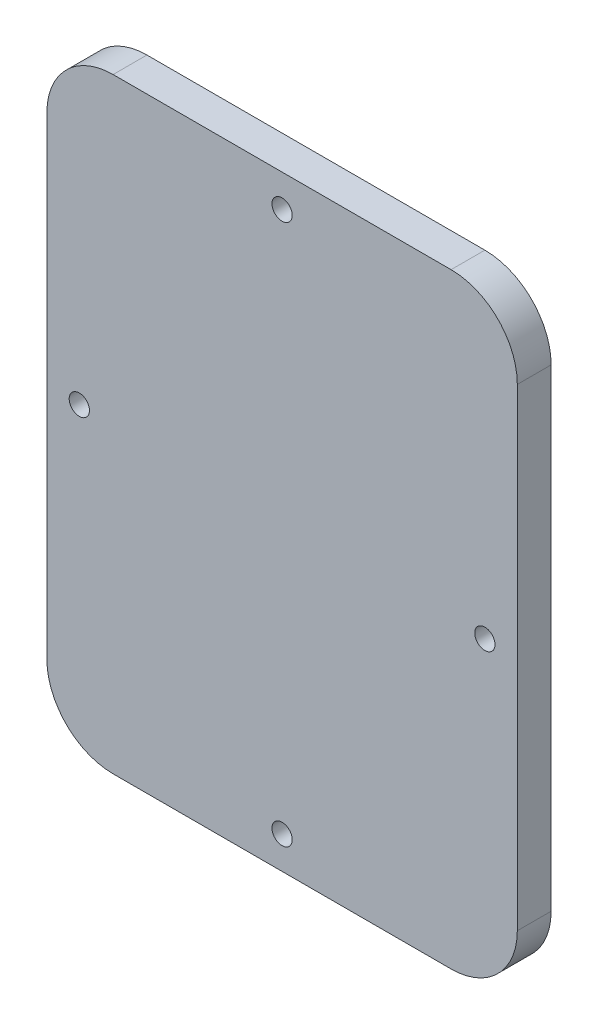
ISO-10303-21;
HEADER;
FILE_DESCRIPTION(('STEP AP214'),'2;1');
FILE_NAME('part.step','',(''),(''),'','','');
FILE_SCHEMA(('AUTOMOTIVE_DESIGN { 1 0 10303 214 1 1 1 1 }'));
ENDSEC;
DATA;
#1=APPLICATION_CONTEXT('core data for automotive mechanical design processes');
#2=APPLICATION_PROTOCOL_DEFINITION('international standard','automotive_design',2000,#1);
#3=PRODUCT_CONTEXT('',#1,'mechanical');
#4=PRODUCT('Part','Part','',(#3));
#5=PRODUCT_RELATED_PRODUCT_CATEGORY('part','',(#4));
#6=PRODUCT_DEFINITION_FORMATION('','',#4);
#7=PRODUCT_DEFINITION_CONTEXT('part definition',#1,'design');
#8=PRODUCT_DEFINITION('design','',#6,#7);
#9=PRODUCT_DEFINITION_SHAPE('','',#8);
#10=(LENGTH_UNIT() NAMED_UNIT(*) SI_UNIT(.MILLI.,.METRE.));
#11=(NAMED_UNIT(*) PLANE_ANGLE_UNIT() SI_UNIT($,.RADIAN.));
#12=(NAMED_UNIT(*) SI_UNIT($,.STERADIAN.) SOLID_ANGLE_UNIT());
#13=UNCERTAINTY_MEASURE_WITH_UNIT(LENGTH_MEASURE(1.E-05),#10,'distance_accuracy_value','');
#14=(GEOMETRIC_REPRESENTATION_CONTEXT(3) GLOBAL_UNCERTAINTY_ASSIGNED_CONTEXT((#13)) GLOBAL_UNIT_ASSIGNED_CONTEXT((#10,
#11,#12)) REPRESENTATION_CONTEXT('',''));
#15=CARTESIAN_POINT('',(0.,0.,0.));
#16=DIRECTION('',(0.,0.,1.));
#17=DIRECTION('',(1.,0.,0.));
#18=AXIS2_PLACEMENT_3D('',#15,#16,#17);
#19=CARTESIAN_POINT('',(34.8,0.,5.));
#20=DIRECTION('',(-1.,0.,0.));
#21=DIRECTION('',(0.,0.,1.));
#22=AXIS2_PLACEMENT_3D('',#19,#20,#21);
#23=PLANE('',#22);
#24=DIRECTION('',(0.,1.,0.));
#25=VECTOR('',#24,1.);
#26=CARTESIAN_POINT('',(34.8,0.,0.));
#27=LINE('',#26,#25);
#28=CARTESIAN_POINT('',(34.8,-34.9999999999999,0.));
#29=VERTEX_POINT('',#28);
#30=CARTESIAN_POINT('',(34.8,34.9999999999999,0.));
#31=VERTEX_POINT('',#30);
#32=EDGE_CURVE('E162',#29,#31,#27,.T.);
#33=ORIENTED_EDGE('',*,*,#32,.T.);
#34=DIRECTION('',(0.,0.,-1.));
#35=VECTOR('',#34,1.);
#36=CARTESIAN_POINT('',(34.8,34.9999999999999,5.));
#37=LINE('',#36,#35);
#38=CARTESIAN_POINT('',(34.8,34.9999999999999,5.));
#39=VERTEX_POINT('',#38);
#40=EDGE_CURVE('E11',#39,#31,#37,.T.);
#41=ORIENTED_EDGE('',*,*,#40,.F.);
#42=DIRECTION('',(0.,1.,0.));
#43=VECTOR('',#42,1.);
#44=CARTESIAN_POINT('',(34.8,0.,5.));
#45=LINE('',#44,#43);
#46=CARTESIAN_POINT('',(34.8,-34.9999999999999,5.));
#47=VERTEX_POINT('',#46);
#48=EDGE_CURVE('E231',#47,#39,#45,.T.);
#49=ORIENTED_EDGE('',*,*,#48,.F.);
#50=DIRECTION('',(0.,0.,-1.));
#51=VECTOR('',#50,1.);
#52=CARTESIAN_POINT('',(34.8,-34.9999999999999,5.));
#53=LINE('',#52,#51);
#54=EDGE_CURVE('E149',#47,#29,#53,.T.);
#55=ORIENTED_EDGE('',*,*,#54,.T.);
#56=EDGE_LOOP('',(#33,#41,#49,#55));
#57=FACE_BOUND('',#56,.T.);
#58=ADVANCED_FACE('F45',(#57),#23,.F.);
#59=CARTESIAN_POINT('',(25.,35.,5.));
#60=DIRECTION('',(0.,0.,-1.));
#61=DIRECTION('',(-1.,0.,0.));
#62=AXIS2_PLACEMENT_3D('',#59,#60,#61);
#63=CYLINDRICAL_SURFACE('',#62,9.8);
#64=CARTESIAN_POINT('',(25.,35.,0.));
#65=DIRECTION('',(0.,0.,1.));
#66=DIRECTION('',(1.,0.,0.));
#67=AXIS2_PLACEMENT_3D('',#64,#65,#66);
#68=CIRCLE('',#67,9.8);
#69=CARTESIAN_POINT('',(24.9999999999999,44.8,0.));
#70=VERTEX_POINT('',#69);
#71=EDGE_CURVE('E166',#31,#70,#68,.T.);
#72=ORIENTED_EDGE('',*,*,#71,.T.);
#73=DIRECTION('',(0.,0.,-1.));
#74=VECTOR('',#73,1.);
#75=CARTESIAN_POINT('',(24.9999999999999,44.8,5.));
#76=LINE('',#75,#74);
#77=CARTESIAN_POINT('',(24.9999999999999,44.8,5.));
#78=VERTEX_POINT('',#77);
#79=EDGE_CURVE('E55',#78,#70,#76,.T.);
#80=ORIENTED_EDGE('',*,*,#79,.F.);
#81=CARTESIAN_POINT('',(25.,35.,5.));
#82=DIRECTION('',(0.,0.,1.));
#83=DIRECTION('',(1.,0.,0.));
#84=AXIS2_PLACEMENT_3D('',#81,#82,#83);
#85=CIRCLE('',#84,9.8);
#86=EDGE_CURVE('E102',#39,#78,#85,.T.);
#87=ORIENTED_EDGE('',*,*,#86,.F.);
#88=ORIENTED_EDGE('',*,*,#40,.T.);
#89=EDGE_LOOP('',(#72,#80,#87,#88));
#90=FACE_BOUND('',#89,.T.);
#91=ADVANCED_FACE('F274',(#90),#63,.T.);
#92=CARTESIAN_POINT('',(0.,44.8,5.));
#93=DIRECTION('',(0.,-1.,0.));
#94=DIRECTION('',(0.,0.,-1.));
#95=AXIS2_PLACEMENT_3D('',#92,#93,#94);
#96=PLANE('',#95);
#97=DIRECTION('',(-1.,0.,0.));
#98=VECTOR('',#97,1.);
#99=CARTESIAN_POINT('',(0.,44.8,0.));
#100=LINE('',#99,#98);
#101=CARTESIAN_POINT('',(-24.9999999999999,44.8,0.));
#102=VERTEX_POINT('',#101);
#103=EDGE_CURVE('E169',#70,#102,#100,.T.);
#104=ORIENTED_EDGE('',*,*,#103,.T.);
#105=DIRECTION('',(0.,0.,-1.));
#106=VECTOR('',#105,1.);
#107=CARTESIAN_POINT('',(-24.9999999999999,44.8,5.));
#108=LINE('',#107,#106);
#109=CARTESIAN_POINT('',(-24.9999999999999,44.8,5.));
#110=VERTEX_POINT('',#109);
#111=EDGE_CURVE('E201',#110,#102,#108,.T.);
#112=ORIENTED_EDGE('',*,*,#111,.F.);
#113=DIRECTION('',(-1.,0.,0.));
#114=VECTOR('',#113,1.);
#115=CARTESIAN_POINT('',(0.,44.8,5.));
#116=LINE('',#115,#114);
#117=EDGE_CURVE('E211',#78,#110,#116,.T.);
#118=ORIENTED_EDGE('',*,*,#117,.F.);
#119=ORIENTED_EDGE('',*,*,#79,.T.);
#120=EDGE_LOOP('',(#104,#112,#118,#119));
#121=FACE_BOUND('',#120,.T.);
#122=ADVANCED_FACE('F209',(#121),#96,.F.);
#123=CARTESIAN_POINT('',(-25.,35.,5.));
#124=DIRECTION('',(0.,0.,-1.));
#125=DIRECTION('',(-1.,0.,0.));
#126=AXIS2_PLACEMENT_3D('',#123,#124,#125);
#127=CYLINDRICAL_SURFACE('',#126,9.80000000000001);
#128=CARTESIAN_POINT('',(-25.,35.,0.));
#129=DIRECTION('',(0.,0.,1.));
#130=DIRECTION('',(1.,0.,0.));
#131=AXIS2_PLACEMENT_3D('',#128,#129,#130);
#132=CIRCLE('',#131,9.80000000000001);
#133=CARTESIAN_POINT('',(-34.8,34.9999999999999,0.));
#134=VERTEX_POINT('',#133);
#135=EDGE_CURVE('E172',#102,#134,#132,.T.);
#136=ORIENTED_EDGE('',*,*,#135,.T.);
#137=DIRECTION('',(0.,0.,-1.));
#138=VECTOR('',#137,1.);
#139=CARTESIAN_POINT('',(-34.8,34.9999999999999,5.));
#140=LINE('',#139,#138);
#141=CARTESIAN_POINT('',(-34.8,34.9999999999999,5.));
#142=VERTEX_POINT('',#141);
#143=EDGE_CURVE('E198',#142,#134,#140,.T.);
#144=ORIENTED_EDGE('',*,*,#143,.F.);
#145=CARTESIAN_POINT('',(-25.,35.,5.));
#146=DIRECTION('',(0.,0.,1.));
#147=DIRECTION('',(1.,0.,0.));
#148=AXIS2_PLACEMENT_3D('',#145,#146,#147);
#149=CIRCLE('',#148,9.80000000000001);
#150=EDGE_CURVE('E222',#110,#142,#149,.T.);
#151=ORIENTED_EDGE('',*,*,#150,.F.);
#152=ORIENTED_EDGE('',*,*,#111,.T.);
#153=EDGE_LOOP('',(#136,#144,#151,#152));
#154=FACE_BOUND('',#153,.T.);
#155=ADVANCED_FACE('F220',(#154),#127,.T.);
#156=CARTESIAN_POINT('',(-34.8,0.,5.));
#157=DIRECTION('',(-1.,0.,0.));
#158=DIRECTION('',(0.,0.,1.));
#159=AXIS2_PLACEMENT_3D('',#156,#157,#158);
#160=PLANE('',#159);
#161=DIRECTION('',(0.,1.,0.));
#162=VECTOR('',#161,1.);
#163=CARTESIAN_POINT('',(-34.8,0.,0.));
#164=LINE('',#163,#162);
#165=CARTESIAN_POINT('',(-34.8,-34.9999999999999,0.));
#166=VERTEX_POINT('',#165);
#167=EDGE_CURVE('E176',#166,#134,#164,.T.);
#168=ORIENTED_EDGE('',*,*,#167,.F.);
#169=DIRECTION('',(0.,0.,-1.));
#170=VECTOR('',#169,1.);
#171=CARTESIAN_POINT('',(-34.8,-34.9999999999999,5.));
#172=LINE('',#171,#170);
#173=CARTESIAN_POINT('',(-34.8,-34.9999999999999,5.));
#174=VERTEX_POINT('',#173);
#175=EDGE_CURVE('E128',#174,#166,#172,.T.);
#176=ORIENTED_EDGE('',*,*,#175,.F.);
#177=DIRECTION('',(0.,1.,0.));
#178=VECTOR('',#177,1.);
#179=CARTESIAN_POINT('',(-34.8,0.,5.));
#180=LINE('',#179,#178);
#181=EDGE_CURVE('E135',#174,#142,#180,.T.);
#182=ORIENTED_EDGE('',*,*,#181,.T.);
#183=ORIENTED_EDGE('',*,*,#143,.T.);
#184=EDGE_LOOP('',(#168,#176,#182,#183));
#185=FACE_BOUND('',#184,.T.);
#186=ADVANCED_FACE('F285',(#185),#160,.T.);
#187=CARTESIAN_POINT('',(-25.,-35.,5.));
#188=DIRECTION('',(0.,0.,-1.));
#189=DIRECTION('',(-1.,0.,0.));
#190=AXIS2_PLACEMENT_3D('',#187,#188,#189);
#191=CYLINDRICAL_SURFACE('',#190,9.8);
#192=CARTESIAN_POINT('',(-25.,-35.,0.));
#193=DIRECTION('',(0.,0.,1.));
#194=DIRECTION('',(1.,0.,0.));
#195=AXIS2_PLACEMENT_3D('',#192,#193,#194);
#196=CIRCLE('',#195,9.8);
#197=CARTESIAN_POINT('',(-24.9999999999999,-44.8,0.));
#198=VERTEX_POINT('',#197);
#199=EDGE_CURVE('E122',#198,#166,#196,.F.);
#200=ORIENTED_EDGE('',*,*,#199,.F.);
#201=DIRECTION('',(0.,0.,-1.));
#202=VECTOR('',#201,1.);
#203=CARTESIAN_POINT('',(-24.9999999999999,-44.8,5.));
#204=LINE('',#203,#202);
#205=CARTESIAN_POINT('',(-24.9999999999999,-44.8,5.));
#206=VERTEX_POINT('',#205);
#207=EDGE_CURVE('E117',#206,#198,#204,.T.);
#208=ORIENTED_EDGE('',*,*,#207,.F.);
#209=CARTESIAN_POINT('',(-25.,-35.,5.));
#210=DIRECTION('',(0.,0.,1.));
#211=DIRECTION('',(1.,0.,0.));
#212=AXIS2_PLACEMENT_3D('',#209,#210,#211);
#213=CIRCLE('',#212,9.8);
#214=EDGE_CURVE('E120',#206,#174,#213,.F.);
#215=ORIENTED_EDGE('',*,*,#214,.T.);
#216=ORIENTED_EDGE('',*,*,#175,.T.);
#217=EDGE_LOOP('',(#200,#208,#215,#216));
#218=FACE_BOUND('',#217,.T.);
#219=ADVANCED_FACE('F119',(#218),#191,.T.);
#220=CARTESIAN_POINT('',(0.,-44.8,5.));
#221=DIRECTION('',(0.,-1.,0.));
#222=DIRECTION('',(1.,0.,0.));
#223=AXIS2_PLACEMENT_3D('',#220,#221,#222);
#224=PLANE('',#223);
#225=DIRECTION('',(-1.,0.,0.));
#226=VECTOR('',#225,1.);
#227=CARTESIAN_POINT('',(0.,-44.8,0.));
#228=LINE('',#227,#226);
#229=CARTESIAN_POINT('',(24.9999999999999,-44.8,0.));
#230=VERTEX_POINT('',#229);
#231=EDGE_CURVE('E182',#230,#198,#228,.T.);
#232=ORIENTED_EDGE('',*,*,#231,.F.);
#233=DIRECTION('',(0.,0.,-1.));
#234=VECTOR('',#233,1.);
#235=CARTESIAN_POINT('',(24.9999999999999,-44.8,5.));
#236=LINE('',#235,#234);
#237=CARTESIAN_POINT('',(24.9999999999999,-44.8,5.));
#238=VERTEX_POINT('',#237);
#239=EDGE_CURVE('E91',#238,#230,#236,.T.);
#240=ORIENTED_EDGE('',*,*,#239,.F.);
#241=DIRECTION('',(-1.,0.,0.));
#242=VECTOR('',#241,1.);
#243=CARTESIAN_POINT('',(0.,-44.8,5.));
#244=LINE('',#243,#242);
#245=EDGE_CURVE('E133',#238,#206,#244,.T.);
#246=ORIENTED_EDGE('',*,*,#245,.T.);
#247=ORIENTED_EDGE('',*,*,#207,.T.);
#248=EDGE_LOOP('',(#232,#240,#246,#247));
#249=FACE_BOUND('',#248,.T.);
#250=ADVANCED_FACE('F138',(#249),#224,.T.);
#251=CARTESIAN_POINT('',(25.,-35.,5.));
#252=DIRECTION('',(0.,0.,-1.));
#253=DIRECTION('',(-1.,0.,0.));
#254=AXIS2_PLACEMENT_3D('',#251,#252,#253);
#255=CYLINDRICAL_SURFACE('',#254,9.8);
#256=CARTESIAN_POINT('',(25.,-35.,0.));
#257=DIRECTION('',(0.,0.,1.));
#258=DIRECTION('',(1.,0.,0.));
#259=AXIS2_PLACEMENT_3D('',#256,#257,#258);
#260=CIRCLE('',#259,9.8);
#261=EDGE_CURVE('E94',#230,#29,#260,.T.);
#262=ORIENTED_EDGE('',*,*,#261,.T.);
#263=ORIENTED_EDGE('',*,*,#54,.F.);
#264=CARTESIAN_POINT('',(25.,-35.,5.));
#265=DIRECTION('',(0.,0.,1.));
#266=DIRECTION('',(1.,0.,0.));
#267=AXIS2_PLACEMENT_3D('',#264,#265,#266);
#268=CIRCLE('',#267,9.8);
#269=EDGE_CURVE('E63',#238,#47,#268,.T.);
#270=ORIENTED_EDGE('',*,*,#269,.F.);
#271=ORIENTED_EDGE('',*,*,#239,.T.);
#272=EDGE_LOOP('',(#262,#263,#270,#271));
#273=FACE_BOUND('',#272,.T.);
#274=ADVANCED_FACE('F263',(#273),#255,.T.);
#275=CARTESIAN_POINT('',(0.,40.,5.));
#276=DIRECTION('',(0.,0.,-1.));
#277=DIRECTION('',(-1.,0.,0.));
#278=AXIS2_PLACEMENT_3D('',#275,#276,#277);
#279=CYLINDRICAL_SURFACE('',#278,1.5);
#280=CARTESIAN_POINT('',(0.,40.,5.));
#281=DIRECTION('',(0.,0.,1.));
#282=DIRECTION('',(1.,0.,0.));
#283=AXIS2_PLACEMENT_3D('',#280,#281,#282);
#284=CIRCLE('',#283,1.5);
#285=CARTESIAN_POINT('',(1.50000000000001,40.,5.));
#286=VERTEX_POINT('',#285);
#287=EDGE_CURVE('E234',#286,#286,#284,.T.);
#288=ORIENTED_EDGE('',*,*,#287,.T.);
#289=EDGE_LOOP('',(#288));
#290=FACE_BOUND('',#289,.T.);
#291=CARTESIAN_POINT('',(0.,40.,0.));
#292=DIRECTION('',(0.,0.,1.));
#293=DIRECTION('',(1.,0.,0.));
#294=AXIS2_PLACEMENT_3D('',#291,#292,#293);
#295=CIRCLE('',#294,1.5);
#296=CARTESIAN_POINT('',(1.50000000000001,40.,0.));
#297=VERTEX_POINT('',#296);
#298=EDGE_CURVE('E158',#297,#297,#295,.T.);
#299=ORIENTED_EDGE('',*,*,#298,.F.);
#300=EDGE_LOOP('',(#299));
#301=FACE_BOUND('',#300,.T.);
#302=ADVANCED_FACE('F261',(#290,#301),#279,.F.);
#303=CARTESIAN_POINT('',(-30.,0.,5.));
#304=DIRECTION('',(0.,0.,-1.));
#305=DIRECTION('',(-1.,0.,0.));
#306=AXIS2_PLACEMENT_3D('',#303,#304,#305);
#307=CYLINDRICAL_SURFACE('',#306,1.5);
#308=CARTESIAN_POINT('',(-30.,0.,5.));
#309=DIRECTION('',(0.,0.,1.));
#310=DIRECTION('',(1.,0.,0.));
#311=AXIS2_PLACEMENT_3D('',#308,#309,#310);
#312=CIRCLE('',#311,1.5);
#313=CARTESIAN_POINT('',(-28.5,0.,5.));
#314=VERTEX_POINT('',#313);
#315=EDGE_CURVE('E238',#314,#314,#312,.T.);
#316=ORIENTED_EDGE('',*,*,#315,.T.);
#317=EDGE_LOOP('',(#316));
#318=FACE_BOUND('',#317,.T.);
#319=CARTESIAN_POINT('',(-30.,0.,0.));
#320=DIRECTION('',(0.,0.,1.));
#321=DIRECTION('',(1.,0.,0.));
#322=AXIS2_PLACEMENT_3D('',#319,#320,#321);
#323=CIRCLE('',#322,1.5);
#324=CARTESIAN_POINT('',(-28.5,0.,0.));
#325=VERTEX_POINT('',#324);
#326=EDGE_CURVE('E154',#325,#325,#323,.T.);
#327=ORIENTED_EDGE('',*,*,#326,.F.);
#328=EDGE_LOOP('',(#327));
#329=FACE_BOUND('',#328,.T.);
#330=ADVANCED_FACE('F251',(#318,#329),#307,.F.);
#331=CARTESIAN_POINT('',(30.,0.,5.));
#332=DIRECTION('',(0.,0.,-1.));
#333=DIRECTION('',(-1.,0.,0.));
#334=AXIS2_PLACEMENT_3D('',#331,#332,#333);
#335=CYLINDRICAL_SURFACE('',#334,1.5);
#336=CARTESIAN_POINT('',(30.,0.,5.));
#337=DIRECTION('',(0.,0.,1.));
#338=DIRECTION('',(1.,0.,0.));
#339=AXIS2_PLACEMENT_3D('',#336,#337,#338);
#340=CIRCLE('',#339,1.5);
#341=CARTESIAN_POINT('',(31.5,0.,5.));
#342=VERTEX_POINT('',#341);
#343=EDGE_CURVE('E191',#342,#342,#340,.F.);
#344=ORIENTED_EDGE('',*,*,#343,.F.);
#345=EDGE_LOOP('',(#344));
#346=FACE_BOUND('',#345,.T.);
#347=CARTESIAN_POINT('',(30.,0.,0.));
#348=DIRECTION('',(0.,0.,1.));
#349=DIRECTION('',(1.,0.,0.));
#350=AXIS2_PLACEMENT_3D('',#347,#348,#349);
#351=CIRCLE('',#350,1.5);
#352=CARTESIAN_POINT('',(31.5,0.,0.));
#353=VERTEX_POINT('',#352);
#354=EDGE_CURVE('E150',#353,#353,#351,.F.);
#355=ORIENTED_EDGE('',*,*,#354,.T.);
#356=EDGE_LOOP('',(#355));
#357=FACE_BOUND('',#356,.T.);
#358=ADVANCED_FACE('F47',(#346,#357),#335,.F.);
#359=CARTESIAN_POINT('',(0.,-40.,5.));
#360=DIRECTION('',(0.,0.,-1.));
#361=DIRECTION('',(-1.,0.,0.));
#362=AXIS2_PLACEMENT_3D('',#359,#360,#361);
#363=CYLINDRICAL_SURFACE('',#362,1.5);
#364=CARTESIAN_POINT('',(0.,-40.,5.));
#365=DIRECTION('',(0.,0.,1.));
#366=DIRECTION('',(1.,0.,0.));
#367=AXIS2_PLACEMENT_3D('',#364,#365,#366);
#368=CIRCLE('',#367,1.5);
#369=CARTESIAN_POINT('',(1.49999999999998,-40.,5.));
#370=VERTEX_POINT('',#369);
#371=EDGE_CURVE('E142',#370,#370,#368,.F.);
#372=ORIENTED_EDGE('',*,*,#371,.F.);
#373=EDGE_LOOP('',(#372));
#374=FACE_BOUND('',#373,.T.);
#375=CARTESIAN_POINT('',(0.,-40.,0.));
#376=DIRECTION('',(0.,0.,1.));
#377=DIRECTION('',(1.,0.,0.));
#378=AXIS2_PLACEMENT_3D('',#375,#376,#377);
#379=CIRCLE('',#378,1.5);
#380=CARTESIAN_POINT('',(1.49999999999998,-40.,0.));
#381=VERTEX_POINT('',#380);
#382=EDGE_CURVE('E187',#381,#381,#379,.F.);
#383=ORIENTED_EDGE('',*,*,#382,.T.);
#384=EDGE_LOOP('',(#383));
#385=FACE_BOUND('',#384,.T.);
#386=ADVANCED_FACE('F250',(#374,#385),#363,.F.);
#387=CARTESIAN_POINT('',(0.,0.,5.));
#388=DIRECTION('',(0.,0.,1.));
#389=DIRECTION('',(1.,0.,0.));
#390=AXIS2_PLACEMENT_3D('',#387,#388,#389);
#391=PLANE('',#390);
#392=ORIENTED_EDGE('',*,*,#343,.T.);
#393=EDGE_LOOP('',(#392));
#394=FACE_BOUND('',#393,.T.);
#395=ORIENTED_EDGE('',*,*,#315,.F.);
#396=EDGE_LOOP('',(#395));
#397=FACE_BOUND('',#396,.T.);
#398=ORIENTED_EDGE('',*,*,#287,.F.);
#399=EDGE_LOOP('',(#398));
#400=FACE_BOUND('',#399,.T.);
#401=ORIENTED_EDGE('',*,*,#48,.T.);
#402=ORIENTED_EDGE('',*,*,#86,.T.);
#403=ORIENTED_EDGE('',*,*,#117,.T.);
#404=ORIENTED_EDGE('',*,*,#150,.T.);
#405=ORIENTED_EDGE('',*,*,#181,.F.);
#406=ORIENTED_EDGE('',*,*,#214,.F.);
#407=ORIENTED_EDGE('',*,*,#245,.F.);
#408=ORIENTED_EDGE('',*,*,#269,.T.);
#409=EDGE_LOOP('',(#401,#402,#403,#404,#405,#406,#407,#408));
#410=FACE_BOUND('',#409,.T.);
#411=ORIENTED_EDGE('',*,*,#371,.T.);
#412=EDGE_LOOP('',(#411));
#413=FACE_BOUND('',#412,.T.);
#414=ADVANCED_FACE('F131',(#394,#397,#400,#410,#413),#391,.T.);
#415=CARTESIAN_POINT('',(0.,0.,0.));
#416=DIRECTION('',(0.,0.,1.));
#417=DIRECTION('',(1.,0.,0.));
#418=AXIS2_PLACEMENT_3D('',#415,#416,#417);
#419=PLANE('',#418);
#420=ORIENTED_EDGE('',*,*,#354,.F.);
#421=EDGE_LOOP('',(#420));
#422=FACE_BOUND('',#421,.T.);
#423=ORIENTED_EDGE('',*,*,#326,.T.);
#424=EDGE_LOOP('',(#423));
#425=FACE_BOUND('',#424,.T.);
#426=ORIENTED_EDGE('',*,*,#298,.T.);
#427=EDGE_LOOP('',(#426));
#428=FACE_BOUND('',#427,.T.);
#429=ORIENTED_EDGE('',*,*,#32,.F.);
#430=ORIENTED_EDGE('',*,*,#261,.F.);
#431=ORIENTED_EDGE('',*,*,#231,.T.);
#432=ORIENTED_EDGE('',*,*,#199,.T.);
#433=ORIENTED_EDGE('',*,*,#167,.T.);
#434=ORIENTED_EDGE('',*,*,#135,.F.);
#435=ORIENTED_EDGE('',*,*,#103,.F.);
#436=ORIENTED_EDGE('',*,*,#71,.F.);
#437=EDGE_LOOP('',(#429,#430,#431,#432,#433,#434,#435,#436));
#438=FACE_BOUND('',#437,.T.);
#439=ORIENTED_EDGE('',*,*,#382,.F.);
#440=EDGE_LOOP('',(#439));
#441=FACE_BOUND('',#440,.T.);
#442=ADVANCED_FACE('F215',(#422,#425,#428,#438,#441),#419,.F.);
#443=CLOSED_SHELL('',(#58,#91,#122,#155,#186,#219,#250,#274,#302,#330,#358,#386,#414,#442));
#444=MANIFOLD_SOLID_BREP('B2',#443);
#445=ADVANCED_BREP_SHAPE_REPRESENTATION('',(#18,#444),#14);
#446=SHAPE_DEFINITION_REPRESENTATION(#9,#445);
ENDSEC;
END-ISO-10303-21;
